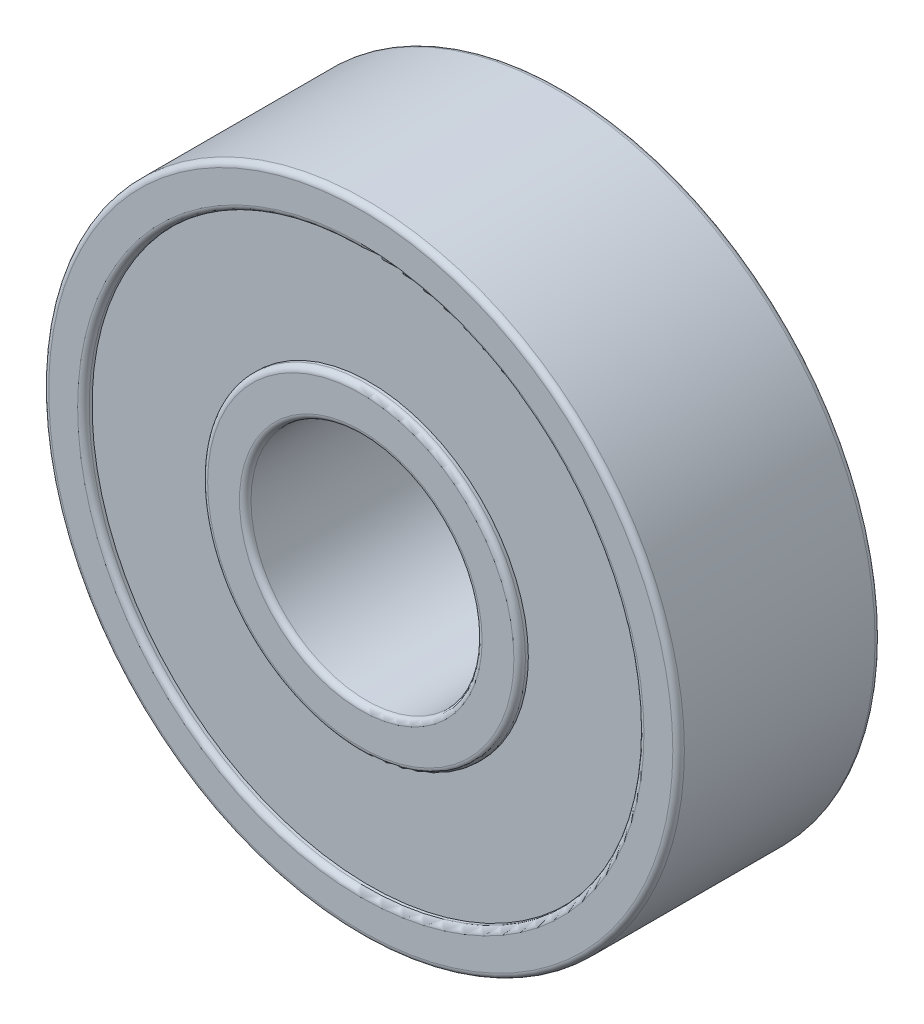
ISO-10303-21;
HEADER;
FILE_DESCRIPTION(('STEP AP214'),'2;1');
FILE_NAME('part.step','',(''),(''),'','','');
FILE_SCHEMA(('AUTOMOTIVE_DESIGN { 1 0 10303 214 1 1 1 1 }'));
ENDSEC;
DATA;
#1=APPLICATION_CONTEXT('core data for automotive mechanical design processes');
#2=APPLICATION_PROTOCOL_DEFINITION('international standard','automotive_design',2000,#1);
#3=PRODUCT_CONTEXT('',#1,'mechanical');
#4=PRODUCT('Part','Part','',(#3));
#5=PRODUCT_RELATED_PRODUCT_CATEGORY('part','',(#4));
#6=PRODUCT_DEFINITION_FORMATION('','',#4);
#7=PRODUCT_DEFINITION_CONTEXT('part definition',#1,'design');
#8=PRODUCT_DEFINITION('design','',#6,#7);
#9=PRODUCT_DEFINITION_SHAPE('','',#8);
#10=(LENGTH_UNIT() NAMED_UNIT(*) SI_UNIT(.MILLI.,.METRE.));
#11=(NAMED_UNIT(*) PLANE_ANGLE_UNIT() SI_UNIT($,.RADIAN.));
#12=(NAMED_UNIT(*) SI_UNIT($,.STERADIAN.) SOLID_ANGLE_UNIT());
#13=UNCERTAINTY_MEASURE_WITH_UNIT(LENGTH_MEASURE(1.E-05),#10,'distance_accuracy_value','');
#14=(GEOMETRIC_REPRESENTATION_CONTEXT(3) GLOBAL_UNCERTAINTY_ASSIGNED_CONTEXT((#13)) GLOBAL_UNIT_ASSIGNED_CONTEXT((#10,
#11,#12)) REPRESENTATION_CONTEXT('',''));
#15=CARTESIAN_POINT('',(0.,0.,0.));
#16=DIRECTION('',(0.,0.,1.));
#17=DIRECTION('',(1.,0.,0.));
#18=AXIS2_PLACEMENT_3D('',#15,#16,#17);
#19=CARTESIAN_POINT('',(0.,0.,3.5));
#20=DIRECTION('',(0.,0.,1.));
#21=DIRECTION('',(1.,0.,0.));
#22=AXIS2_PLACEMENT_3D('',#19,#20,#21);
#23=PLANE('',#22);
#24=CARTESIAN_POINT('',(0.,0.,3.5));
#25=DIRECTION('',(0.,0.,1.));
#26=DIRECTION('',(1.,0.,0.));
#27=AXIS2_PLACEMENT_3D('',#24,#25,#26);
#28=CIRCLE('',#27,9.8);
#29=CARTESIAN_POINT('',(9.8,0.,3.5));
#30=VERTEX_POINT('',#29);
#31=EDGE_CURVE('E85',#30,#30,#28,.F.);
#32=ORIENTED_EDGE('',*,*,#31,.T.);
#33=EDGE_LOOP('',(#32));
#34=FACE_BOUND('',#33,.T.);
#35=CARTESIAN_POINT('',(0.,0.,3.5));
#36=DIRECTION('',(0.,0.,1.));
#37=DIRECTION('',(1.,0.,0.));
#38=AXIS2_PLACEMENT_3D('',#35,#36,#37);
#39=CIRCLE('',#38,10.8);
#40=CARTESIAN_POINT('',(10.8,0.,3.5));
#41=VERTEX_POINT('',#40);
#42=EDGE_CURVE('E88',#41,#41,#39,.T.);
#43=ORIENTED_EDGE('',*,*,#42,.T.);
#44=EDGE_LOOP('',(#43));
#45=FACE_BOUND('',#44,.T.);
#46=ADVANCED_FACE('F38',(#34,#45),#23,.T.);
#47=CARTESIAN_POINT('',(0.,0.,3.5));
#48=DIRECTION('',(0.,0.,1.));
#49=DIRECTION('',(1.,0.,0.));
#50=AXIS2_PLACEMENT_3D('',#47,#48,#49);
#51=CIRCLE('',#50,4.2);
#52=CARTESIAN_POINT('',(4.2,0.,3.5));
#53=VERTEX_POINT('',#52);
#54=EDGE_CURVE('E73',#53,#53,#51,.F.);
#55=ORIENTED_EDGE('',*,*,#54,.T.);
#56=EDGE_LOOP('',(#55));
#57=FACE_BOUND('',#56,.T.);
#58=CARTESIAN_POINT('',(0.,0.,3.5));
#59=DIRECTION('',(0.,0.,1.));
#60=DIRECTION('',(1.,0.,0.));
#61=AXIS2_PLACEMENT_3D('',#58,#59,#60);
#62=CIRCLE('',#61,5.3);
#63=CARTESIAN_POINT('',(5.3,0.,3.5));
#64=VERTEX_POINT('',#63);
#65=EDGE_CURVE('E76',#64,#64,#62,.T.);
#66=ORIENTED_EDGE('',*,*,#65,.T.);
#67=EDGE_LOOP('',(#66));
#68=FACE_BOUND('',#67,.T.);
#69=ADVANCED_FACE('F127',(#57,#68),#23,.T.);
#70=CARTESIAN_POINT('',(0.,0.,-3.5));
#71=DIRECTION('',(0.,0.,1.));
#72=DIRECTION('',(1.,0.,0.));
#73=AXIS2_PLACEMENT_3D('',#70,#71,#72);
#74=PLANE('',#73);
#75=CARTESIAN_POINT('',(0.,0.,-3.5));
#76=DIRECTION('',(0.,0.,1.));
#77=DIRECTION('',(1.,0.,0.));
#78=AXIS2_PLACEMENT_3D('',#75,#76,#77);
#79=CIRCLE('',#78,9.8);
#80=CARTESIAN_POINT('',(9.8,0.,-3.5));
#81=VERTEX_POINT('',#80);
#82=EDGE_CURVE('E53',#81,#81,#79,.T.);
#83=ORIENTED_EDGE('',*,*,#82,.T.);
#84=EDGE_LOOP('',(#83));
#85=FACE_BOUND('',#84,.T.);
#86=CARTESIAN_POINT('',(0.,0.,-3.5));
#87=DIRECTION('',(0.,0.,1.));
#88=DIRECTION('',(1.,0.,0.));
#89=AXIS2_PLACEMENT_3D('',#86,#87,#88);
#90=CIRCLE('',#89,10.8);
#91=CARTESIAN_POINT('',(10.8,0.,-3.5));
#92=VERTEX_POINT('',#91);
#93=EDGE_CURVE('E58',#92,#92,#90,.F.);
#94=ORIENTED_EDGE('',*,*,#93,.T.);
#95=EDGE_LOOP('',(#94));
#96=FACE_BOUND('',#95,.T.);
#97=ADVANCED_FACE('F133',(#85,#96),#74,.F.);
#98=CARTESIAN_POINT('',(0.,0.,-3.5));
#99=DIRECTION('',(0.,0.,1.));
#100=DIRECTION('',(1.,0.,0.));
#101=AXIS2_PLACEMENT_3D('',#98,#99,#100);
#102=CIRCLE('',#101,4.2);
#103=CARTESIAN_POINT('',(4.2,0.,-3.5));
#104=VERTEX_POINT('',#103);
#105=EDGE_CURVE('E64',#104,#104,#102,.T.);
#106=ORIENTED_EDGE('',*,*,#105,.T.);
#107=EDGE_LOOP('',(#106));
#108=FACE_BOUND('',#107,.T.);
#109=CARTESIAN_POINT('',(0.,0.,-3.5));
#110=DIRECTION('',(0.,0.,1.));
#111=DIRECTION('',(1.,0.,0.));
#112=AXIS2_PLACEMENT_3D('',#109,#110,#111);
#113=CIRCLE('',#112,5.3);
#114=CARTESIAN_POINT('',(5.3,0.,-3.5));
#115=VERTEX_POINT('',#114);
#116=EDGE_CURVE('E67',#115,#115,#113,.F.);
#117=ORIENTED_EDGE('',*,*,#116,.T.);
#118=EDGE_LOOP('',(#117));
#119=FACE_BOUND('',#118,.T.);
#120=ADVANCED_FACE('F142',(#108,#119),#74,.F.);
#121=CARTESIAN_POINT('',(0.,0.,3.5));
#122=DIRECTION('',(0.,0.,-1.));
#123=DIRECTION('',(-1.,0.,0.));
#124=AXIS2_PLACEMENT_3D('',#121,#122,#123);
#125=CYLINDRICAL_SURFACE('',#124,11.);
#126=CARTESIAN_POINT('',(0.,0.,3.3));
#127=DIRECTION('',(0.,0.,1.));
#128=DIRECTION('',(1.,0.,0.));
#129=AXIS2_PLACEMENT_3D('',#126,#127,#128);
#130=CIRCLE('',#129,11.);
#131=CARTESIAN_POINT('',(11.,0.,3.3));
#132=VERTEX_POINT('',#131);
#133=EDGE_CURVE('E10',#132,#132,#130,.F.);
#134=ORIENTED_EDGE('',*,*,#133,.T.);
#135=EDGE_LOOP('',(#134));
#136=FACE_BOUND('',#135,.T.);
#137=CARTESIAN_POINT('',(0.,0.,-3.3));
#138=DIRECTION('',(0.,0.,1.));
#139=DIRECTION('',(1.,0.,0.));
#140=AXIS2_PLACEMENT_3D('',#137,#138,#139);
#141=CIRCLE('',#140,11.);
#142=CARTESIAN_POINT('',(11.,0.,-3.3));
#143=VERTEX_POINT('',#142);
#144=EDGE_CURVE('E45',#143,#143,#141,.T.);
#145=ORIENTED_EDGE('',*,*,#144,.T.);
#146=EDGE_LOOP('',(#145));
#147=FACE_BOUND('',#146,.T.);
#148=ADVANCED_FACE('F144',(#136,#147),#125,.T.);
#149=CARTESIAN_POINT('',(0.,0.,3.5));
#150=DIRECTION('',(0.,0.,-1.));
#151=DIRECTION('',(-1.,0.,0.));
#152=AXIS2_PLACEMENT_3D('',#149,#150,#151);
#153=CYLINDRICAL_SURFACE('',#152,4.);
#154=CARTESIAN_POINT('',(0.,0.,3.3));
#155=DIRECTION('',(0.,0.,1.));
#156=DIRECTION('',(1.,0.,0.));
#157=AXIS2_PLACEMENT_3D('',#154,#155,#156);
#158=CIRCLE('',#157,4.);
#159=CARTESIAN_POINT('',(4.,0.,3.3));
#160=VERTEX_POINT('',#159);
#161=EDGE_CURVE('E79',#160,#160,#158,.T.);
#162=ORIENTED_EDGE('',*,*,#161,.T.);
#163=EDGE_LOOP('',(#162));
#164=FACE_BOUND('',#163,.T.);
#165=CARTESIAN_POINT('',(0.,0.,-3.3));
#166=DIRECTION('',(0.,0.,1.));
#167=DIRECTION('',(1.,0.,0.));
#168=AXIS2_PLACEMENT_3D('',#165,#166,#167);
#169=CIRCLE('',#168,4.);
#170=CARTESIAN_POINT('',(4.,0.,-3.3));
#171=VERTEX_POINT('',#170);
#172=EDGE_CURVE('E82',#171,#171,#169,.F.);
#173=ORIENTED_EDGE('',*,*,#172,.T.);
#174=EDGE_LOOP('',(#173));
#175=FACE_BOUND('',#174,.T.);
#176=ADVANCED_FACE('F138',(#164,#175),#153,.F.);
#177=CARTESIAN_POINT('',(0.,5.5,-3.2));
#178=DIRECTION('',(0.,0.,-1.));
#179=DIRECTION('',(-1.,0.,0.));
#180=AXIS2_PLACEMENT_3D('',#177,#178,#179);
#181=PLANE('',#180);
#182=CARTESIAN_POINT('',(0.,0.,-3.2));
#183=DIRECTION('',(0.,0.,1.));
#184=DIRECTION('',(1.,0.,0.));
#185=AXIS2_PLACEMENT_3D('',#182,#183,#184);
#186=CIRCLE('',#185,5.5);
#187=CARTESIAN_POINT('',(5.5,0.,-3.2));
#188=VERTEX_POINT('',#187);
#189=EDGE_CURVE('E97',#188,#188,#186,.T.);
#190=ORIENTED_EDGE('',*,*,#189,.T.);
#191=EDGE_LOOP('',(#190));
#192=FACE_BOUND('',#191,.T.);
#193=CARTESIAN_POINT('',(0.,0.,-3.2));
#194=DIRECTION('',(0.,0.,1.));
#195=DIRECTION('',(1.,0.,0.));
#196=AXIS2_PLACEMENT_3D('',#193,#194,#195);
#197=CIRCLE('',#196,9.6);
#198=CARTESIAN_POINT('',(9.6,0.,-3.2));
#199=VERTEX_POINT('',#198);
#200=EDGE_CURVE('E94',#199,#199,#197,.T.);
#201=ORIENTED_EDGE('',*,*,#200,.F.);
#202=EDGE_LOOP('',(#201));
#203=FACE_BOUND('',#202,.T.);
#204=ADVANCED_FACE('F265',(#192,#203),#181,.T.);
#205=CARTESIAN_POINT('',(0.,0.,8.1816148941698));
#206=DIRECTION('',(0.,0.,1.));
#207=DIRECTION('',(1.,0.,0.));
#208=AXIS2_PLACEMENT_3D('',#205,#206,#207);
#209=CYLINDRICAL_SURFACE('',#208,9.6);
#210=CARTESIAN_POINT('',(0.,0.,-3.3));
#211=DIRECTION('',(0.,0.,1.));
#212=DIRECTION('',(1.,0.,0.));
#213=AXIS2_PLACEMENT_3D('',#210,#211,#212);
#214=CIRCLE('',#213,9.6);
#215=CARTESIAN_POINT('',(9.6,0.,-3.3));
#216=VERTEX_POINT('',#215);
#217=EDGE_CURVE('E49',#216,#216,#214,.F.);
#218=ORIENTED_EDGE('',*,*,#217,.T.);
#219=EDGE_LOOP('',(#218));
#220=FACE_BOUND('',#219,.T.);
#221=ORIENTED_EDGE('',*,*,#200,.T.);
#222=EDGE_LOOP('',(#221));
#223=FACE_BOUND('',#222,.T.);
#224=ADVANCED_FACE('F253',(#220,#223),#209,.F.);
#225=CARTESIAN_POINT('',(0.,0.,8.1816148941698));
#226=DIRECTION('',(0.,0.,1.));
#227=DIRECTION('',(1.,0.,0.));
#228=AXIS2_PLACEMENT_3D('',#225,#226,#227);
#229=CYLINDRICAL_SURFACE('',#228,5.5);
#230=CARTESIAN_POINT('',(0.,0.,-3.3));
#231=DIRECTION('',(0.,0.,1.));
#232=DIRECTION('',(1.,0.,0.));
#233=AXIS2_PLACEMENT_3D('',#230,#231,#232);
#234=CIRCLE('',#233,5.5);
#235=CARTESIAN_POINT('',(5.5,0.,-3.3));
#236=VERTEX_POINT('',#235);
#237=EDGE_CURVE('E61',#236,#236,#234,.T.);
#238=ORIENTED_EDGE('',*,*,#237,.T.);
#239=EDGE_LOOP('',(#238));
#240=FACE_BOUND('',#239,.T.);
#241=ORIENTED_EDGE('',*,*,#189,.F.);
#242=EDGE_LOOP('',(#241));
#243=FACE_BOUND('',#242,.T.);
#244=ADVANCED_FACE('F113',(#240,#243),#229,.T.);
#245=CARTESIAN_POINT('',(0.,5.5,3.2));
#246=DIRECTION('',(0.,0.,1.));
#247=DIRECTION('',(-1.,0.,0.));
#248=AXIS2_PLACEMENT_3D('',#245,#246,#247);
#249=PLANE('',#248);
#250=CARTESIAN_POINT('',(0.,0.,3.2));
#251=DIRECTION('',(0.,0.,1.));
#252=DIRECTION('',(1.,0.,0.));
#253=AXIS2_PLACEMENT_3D('',#250,#251,#252);
#254=CIRCLE('',#253,5.5);
#255=CARTESIAN_POINT('',(5.5,0.,3.2));
#256=VERTEX_POINT('',#255);
#257=EDGE_CURVE('E103',#256,#256,#254,.T.);
#258=ORIENTED_EDGE('',*,*,#257,.F.);
#259=EDGE_LOOP('',(#258));
#260=FACE_BOUND('',#259,.T.);
#261=CARTESIAN_POINT('',(0.,0.,3.2));
#262=DIRECTION('',(0.,0.,1.));
#263=DIRECTION('',(1.,0.,0.));
#264=AXIS2_PLACEMENT_3D('',#261,#262,#263);
#265=CIRCLE('',#264,9.6);
#266=CARTESIAN_POINT('',(9.6,0.,3.2));
#267=VERTEX_POINT('',#266);
#268=EDGE_CURVE('E100',#267,#267,#265,.T.);
#269=ORIENTED_EDGE('',*,*,#268,.T.);
#270=EDGE_LOOP('',(#269));
#271=FACE_BOUND('',#270,.T.);
#272=ADVANCED_FACE('F109',(#260,#271),#249,.T.);
#273=CARTESIAN_POINT('',(0.,0.,-8.1816148941698));
#274=DIRECTION('',(0.,0.,-1.));
#275=DIRECTION('',(1.,0.,0.));
#276=AXIS2_PLACEMENT_3D('',#273,#274,#275);
#277=CYLINDRICAL_SURFACE('',#276,9.6);
#278=CARTESIAN_POINT('',(0.,0.,3.3));
#279=DIRECTION('',(0.,0.,1.));
#280=DIRECTION('',(1.,0.,0.));
#281=AXIS2_PLACEMENT_3D('',#278,#279,#280);
#282=CIRCLE('',#281,9.6);
#283=CARTESIAN_POINT('',(9.6,0.,3.3));
#284=VERTEX_POINT('',#283);
#285=EDGE_CURVE('E91',#284,#284,#282,.T.);
#286=ORIENTED_EDGE('',*,*,#285,.T.);
#287=EDGE_LOOP('',(#286));
#288=FACE_BOUND('',#287,.T.);
#289=ORIENTED_EDGE('',*,*,#268,.F.);
#290=EDGE_LOOP('',(#289));
#291=FACE_BOUND('',#290,.T.);
#292=ADVANCED_FACE('F112',(#288,#291),#277,.F.);
#293=CARTESIAN_POINT('',(0.,0.,-8.1816148941698));
#294=DIRECTION('',(0.,0.,-1.));
#295=DIRECTION('',(1.,0.,0.));
#296=AXIS2_PLACEMENT_3D('',#293,#294,#295);
#297=CYLINDRICAL_SURFACE('',#296,5.5);
#298=CARTESIAN_POINT('',(0.,0.,3.3));
#299=DIRECTION('',(0.,0.,1.));
#300=DIRECTION('',(1.,0.,0.));
#301=AXIS2_PLACEMENT_3D('',#298,#299,#300);
#302=CIRCLE('',#301,5.5);
#303=CARTESIAN_POINT('',(5.5,0.,3.3));
#304=VERTEX_POINT('',#303);
#305=EDGE_CURVE('E70',#304,#304,#302,.F.);
#306=ORIENTED_EDGE('',*,*,#305,.T.);
#307=EDGE_LOOP('',(#306));
#308=FACE_BOUND('',#307,.T.);
#309=ORIENTED_EDGE('',*,*,#257,.T.);
#310=EDGE_LOOP('',(#309));
#311=FACE_BOUND('',#310,.T.);
#312=ADVANCED_FACE('F107',(#308,#311),#297,.T.);
#313=CARTESIAN_POINT('',(0.,0.,3.3));
#314=DIRECTION('',(0.,0.,1.));
#315=DIRECTION('',(1.,0.,0.));
#316=AXIS2_PLACEMENT_3D('',#313,#314,#315);
#317=TOROIDAL_SURFACE('',#316,9.8,0.2);
#318=ORIENTED_EDGE('',*,*,#31,.F.);
#319=EDGE_LOOP('',(#318));
#320=FACE_BOUND('',#319,.T.);
#321=ORIENTED_EDGE('',*,*,#285,.F.);
#322=EDGE_LOOP('',(#321));
#323=FACE_BOUND('',#322,.T.);
#324=ADVANCED_FACE('F123',(#320,#323),#317,.T.);
#325=CARTESIAN_POINT('',(0.,0.,3.3));
#326=DIRECTION('',(0.,0.,1.));
#327=DIRECTION('',(1.,0.,0.));
#328=AXIS2_PLACEMENT_3D('',#325,#326,#327);
#329=TOROIDAL_SURFACE('',#328,4.2,0.2);
#330=ORIENTED_EDGE('',*,*,#54,.F.);
#331=EDGE_LOOP('',(#330));
#332=FACE_BOUND('',#331,.T.);
#333=ORIENTED_EDGE('',*,*,#161,.F.);
#334=EDGE_LOOP('',(#333));
#335=FACE_BOUND('',#334,.T.);
#336=ADVANCED_FACE('F149',(#332,#335),#329,.T.);
#337=CARTESIAN_POINT('',(0.,0.,3.3));
#338=DIRECTION('',(0.,0.,1.));
#339=DIRECTION('',(1.,0.,0.));
#340=AXIS2_PLACEMENT_3D('',#337,#338,#339);
#341=TOROIDAL_SURFACE('',#340,5.3,0.2);
#342=ORIENTED_EDGE('',*,*,#305,.F.);
#343=EDGE_LOOP('',(#342));
#344=FACE_BOUND('',#343,.T.);
#345=ORIENTED_EDGE('',*,*,#65,.F.);
#346=EDGE_LOOP('',(#345));
#347=FACE_BOUND('',#346,.T.);
#348=ADVANCED_FACE('F153',(#344,#347),#341,.T.);
#349=CARTESIAN_POINT('',(0.,0.,-3.3));
#350=DIRECTION('',(0.,0.,1.));
#351=DIRECTION('',(1.,0.,0.));
#352=AXIS2_PLACEMENT_3D('',#349,#350,#351);
#353=TOROIDAL_SURFACE('',#352,4.2,0.2);
#354=ORIENTED_EDGE('',*,*,#172,.F.);
#355=EDGE_LOOP('',(#354));
#356=FACE_BOUND('',#355,.T.);
#357=ORIENTED_EDGE('',*,*,#105,.F.);
#358=EDGE_LOOP('',(#357));
#359=FACE_BOUND('',#358,.T.);
#360=ADVANCED_FACE('F157',(#356,#359),#353,.T.);
#361=CARTESIAN_POINT('',(0.,0.,-3.3));
#362=DIRECTION('',(0.,0.,1.));
#363=DIRECTION('',(1.,0.,0.));
#364=AXIS2_PLACEMENT_3D('',#361,#362,#363);
#365=TOROIDAL_SURFACE('',#364,5.3,0.2);
#366=ORIENTED_EDGE('',*,*,#116,.F.);
#367=EDGE_LOOP('',(#366));
#368=FACE_BOUND('',#367,.T.);
#369=ORIENTED_EDGE('',*,*,#237,.F.);
#370=EDGE_LOOP('',(#369));
#371=FACE_BOUND('',#370,.T.);
#372=ADVANCED_FACE('F161',(#368,#371),#365,.T.);
#373=CARTESIAN_POINT('',(0.,0.,-3.3));
#374=DIRECTION('',(0.,0.,1.));
#375=DIRECTION('',(1.,0.,0.));
#376=AXIS2_PLACEMENT_3D('',#373,#374,#375);
#377=TOROIDAL_SURFACE('',#376,9.8,0.2);
#378=ORIENTED_EDGE('',*,*,#217,.F.);
#379=EDGE_LOOP('',(#378));
#380=FACE_BOUND('',#379,.T.);
#381=ORIENTED_EDGE('',*,*,#82,.F.);
#382=EDGE_LOOP('',(#381));
#383=FACE_BOUND('',#382,.T.);
#384=ADVANCED_FACE('F165',(#380,#383),#377,.T.);
#385=CARTESIAN_POINT('',(0.,0.,3.3));
#386=DIRECTION('',(0.,0.,1.));
#387=DIRECTION('',(1.,0.,0.));
#388=AXIS2_PLACEMENT_3D('',#385,#386,#387);
#389=TOROIDAL_SURFACE('',#388,10.8,0.2);
#390=ORIENTED_EDGE('',*,*,#133,.F.);
#391=EDGE_LOOP('',(#390));
#392=FACE_BOUND('',#391,.T.);
#393=ORIENTED_EDGE('',*,*,#42,.F.);
#394=EDGE_LOOP('',(#393));
#395=FACE_BOUND('',#394,.T.);
#396=ADVANCED_FACE('F168',(#392,#395),#389,.T.);
#397=CARTESIAN_POINT('',(0.,0.,-3.3));
#398=DIRECTION('',(0.,0.,1.));
#399=DIRECTION('',(1.,0.,0.));
#400=AXIS2_PLACEMENT_3D('',#397,#398,#399);
#401=TOROIDAL_SURFACE('',#400,10.8,0.2);
#402=ORIENTED_EDGE('',*,*,#93,.F.);
#403=EDGE_LOOP('',(#402));
#404=FACE_BOUND('',#403,.T.);
#405=ORIENTED_EDGE('',*,*,#144,.F.);
#406=EDGE_LOOP('',(#405));
#407=FACE_BOUND('',#406,.T.);
#408=ADVANCED_FACE('F40',(#404,#407),#401,.T.);
#409=CLOSED_SHELL('',(#46,#69,#97,#120,#148,#176,#204,#224,#244,#272,#292,#312,#324,#336,#348,
#360,#372,#384,#396,#408));
#410=MANIFOLD_SOLID_BREP('B2',#409);
#411=ADVANCED_BREP_SHAPE_REPRESENTATION('',(#18,#410),#14);
#412=SHAPE_DEFINITION_REPRESENTATION(#9,#411);
ENDSEC;
END-ISO-10303-21;
